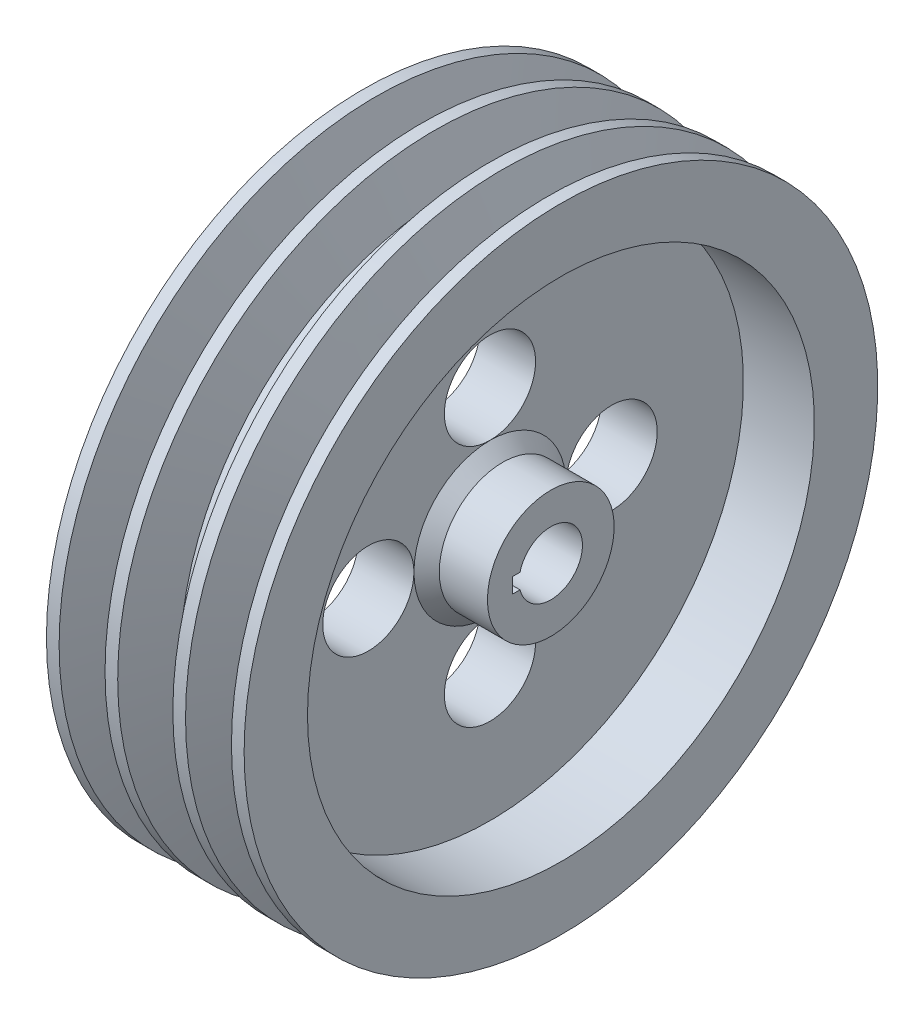
ISO-10303-21;
HEADER;
FILE_DESCRIPTION(('STEP AP214'),'2;1');
FILE_NAME('part.step','',(''),(''),'','','');
FILE_SCHEMA(('AUTOMOTIVE_DESIGN { 1 0 10303 214 1 1 1 1 }'));
ENDSEC;
DATA;
#1=APPLICATION_CONTEXT('core data for automotive mechanical design processes');
#2=APPLICATION_PROTOCOL_DEFINITION('international standard','automotive_design',2000,#1);
#3=PRODUCT_CONTEXT('',#1,'mechanical');
#4=PRODUCT('Part','Part','',(#3));
#5=PRODUCT_RELATED_PRODUCT_CATEGORY('part','',(#4));
#6=PRODUCT_DEFINITION_FORMATION('','',#4);
#7=PRODUCT_DEFINITION_CONTEXT('part definition',#1,'design');
#8=PRODUCT_DEFINITION('design','',#6,#7);
#9=PRODUCT_DEFINITION_SHAPE('','',#8);
#10=(LENGTH_UNIT() NAMED_UNIT(*) SI_UNIT(.MILLI.,.METRE.));
#11=(NAMED_UNIT(*) PLANE_ANGLE_UNIT() SI_UNIT($,.RADIAN.));
#12=(NAMED_UNIT(*) SI_UNIT($,.STERADIAN.) SOLID_ANGLE_UNIT());
#13=UNCERTAINTY_MEASURE_WITH_UNIT(LENGTH_MEASURE(1.E-05),#10,'distance_accuracy_value','');
#14=(GEOMETRIC_REPRESENTATION_CONTEXT(3) GLOBAL_UNCERTAINTY_ASSIGNED_CONTEXT((#13)) GLOBAL_UNIT_ASSIGNED_CONTEXT((#10,
#11,#12)) REPRESENTATION_CONTEXT('',''));
#15=CARTESIAN_POINT('',(0.,0.,0.));
#16=DIRECTION('',(0.,0.,1.));
#17=DIRECTION('',(1.,0.,0.));
#18=AXIS2_PLACEMENT_3D('',#15,#16,#17);
#19=CARTESIAN_POINT('',(39.,100.,0.));
#20=DIRECTION('',(-1.,0.,0.));
#21=DIRECTION('',(0.,0.,1.));
#22=AXIS2_PLACEMENT_3D('',#19,#20,#21);
#23=PLANE('',#22);
#24=CARTESIAN_POINT('',(39.,0.,0.));
#25=DIRECTION('',(-1.,0.,0.));
#26=DIRECTION('',(0.,0.,1.));
#27=AXIS2_PLACEMENT_3D('',#24,#25,#26);
#28=CIRCLE('',#27,125.);
#29=CARTESIAN_POINT('',(39.,0.,125.));
#30=VERTEX_POINT('',#29);
#31=EDGE_CURVE('E189',#30,#30,#28,.T.);
#32=ORIENTED_EDGE('',*,*,#31,.F.);
#33=EDGE_LOOP('',(#32));
#34=FACE_BOUND('',#33,.T.);
#35=CARTESIAN_POINT('',(39.,0.,0.));
#36=DIRECTION('',(-1.,0.,0.));
#37=DIRECTION('',(0.,0.,1.));
#38=AXIS2_PLACEMENT_3D('',#35,#36,#37);
#39=CIRCLE('',#38,100.);
#40=CARTESIAN_POINT('',(39.,0.,100.));
#41=VERTEX_POINT('',#40);
#42=EDGE_CURVE('E227',#41,#41,#39,.T.);
#43=ORIENTED_EDGE('',*,*,#42,.T.);
#44=EDGE_LOOP('',(#43));
#45=FACE_BOUND('',#44,.T.);
#46=ADVANCED_FACE('F38',(#34,#45),#23,.F.);
#47=CARTESIAN_POINT('',(-68.9140826306557,0.,0.));
#48=DIRECTION('',(-1.,0.,0.));
#49=DIRECTION('',(0.,0.,1.));
#50=AXIS2_PLACEMENT_3D('',#47,#48,#49);
#51=CYLINDRICAL_SURFACE('',#50,125.);
#52=CARTESIAN_POINT('',(34.,0.,0.));
#53=DIRECTION('',(-1.,0.,0.));
#54=DIRECTION('',(0.,0.,1.));
#55=AXIS2_PLACEMENT_3D('',#52,#53,#54);
#56=CIRCLE('',#55,125.);
#57=CARTESIAN_POINT('',(34.,0.,125.));
#58=VERTEX_POINT('',#57);
#59=EDGE_CURVE('E186',#58,#58,#56,.T.);
#60=ORIENTED_EDGE('',*,*,#59,.F.);
#61=EDGE_LOOP('',(#60));
#62=FACE_BOUND('',#61,.T.);
#63=ORIENTED_EDGE('',*,*,#31,.T.);
#64=EDGE_LOOP('',(#63));
#65=FACE_BOUND('',#64,.T.);
#66=ADVANCED_FACE('F256',(#62,#65),#51,.T.);
#67=CARTESIAN_POINT('',(34.,0.,0.));
#68=DIRECTION('',(1.,0.,0.));
#69=DIRECTION('',(0.,0.,-1.));
#70=AXIS2_PLACEMENT_3D('',#67,#68,#69);
#71=CONICAL_SURFACE('',#70,125.,1.25569459209027);
#72=CARTESIAN_POINT('',(28.1326842844011,0.,0.));
#73=DIRECTION('',(-1.,0.,0.));
#74=DIRECTION('',(0.,0.,1.));
#75=AXIS2_PLACEMENT_3D('',#72,#73,#74);
#76=CIRCLE('',#75,107.);
#77=CARTESIAN_POINT('',(28.1326842844011,0.,107.));
#78=VERTEX_POINT('',#77);
#79=EDGE_CURVE('E183',#78,#78,#76,.T.);
#80=ORIENTED_EDGE('',*,*,#79,.F.);
#81=EDGE_LOOP('',(#80));
#82=FACE_BOUND('',#81,.T.);
#83=ORIENTED_EDGE('',*,*,#59,.T.);
#84=EDGE_LOOP('',(#83));
#85=FACE_BOUND('',#84,.T.);
#86=ADVANCED_FACE('F261',(#82,#85),#71,.T.);
#87=CARTESIAN_POINT('',(-68.9140826306557,0.,0.));
#88=DIRECTION('',(-1.,0.,0.));
#89=DIRECTION('',(0.,0.,1.));
#90=AXIS2_PLACEMENT_3D('',#87,#88,#89);
#91=CYLINDRICAL_SURFACE('',#90,107.);
#92=CARTESIAN_POINT('',(23.1326842844012,0.,0.));
#93=DIRECTION('',(-1.,0.,0.));
#94=DIRECTION('',(0.,0.,1.));
#95=AXIS2_PLACEMENT_3D('',#92,#93,#94);
#96=CIRCLE('',#95,107.);
#97=CARTESIAN_POINT('',(23.1326842844012,0.,107.));
#98=VERTEX_POINT('',#97);
#99=EDGE_CURVE('E180',#98,#98,#96,.T.);
#100=ORIENTED_EDGE('',*,*,#99,.F.);
#101=EDGE_LOOP('',(#100));
#102=FACE_BOUND('',#101,.T.);
#103=ORIENTED_EDGE('',*,*,#79,.T.);
#104=EDGE_LOOP('',(#103));
#105=FACE_BOUND('',#104,.T.);
#106=ADVANCED_FACE('F583',(#102,#105),#91,.T.);
#107=CARTESIAN_POINT('',(23.1326842844012,0.,0.));
#108=DIRECTION('',(-1.,0.,0.));
#109=DIRECTION('',(0.,0.,1.));
#110=AXIS2_PLACEMENT_3D('',#107,#108,#109);
#111=CONICAL_SURFACE('',#110,107.,1.1877663607018);
#112=CARTESIAN_POINT('',(15.8799383909303,0.,0.));
#113=DIRECTION('',(-1.,0.,0.));
#114=DIRECTION('',(0.,0.,1.));
#115=AXIS2_PLACEMENT_3D('',#112,#113,#114);
#116=CIRCLE('',#115,125.);
#117=CARTESIAN_POINT('',(15.8799383909303,0.,125.));
#118=VERTEX_POINT('',#117);
#119=EDGE_CURVE('E177',#118,#118,#116,.T.);
#120=ORIENTED_EDGE('',*,*,#119,.F.);
#121=EDGE_LOOP('',(#120));
#122=FACE_BOUND('',#121,.T.);
#123=ORIENTED_EDGE('',*,*,#99,.T.);
#124=EDGE_LOOP('',(#123));
#125=FACE_BOUND('',#124,.T.);
#126=ADVANCED_FACE('F573',(#122,#125),#111,.T.);
#127=CARTESIAN_POINT('',(-68.9140826306557,0.,0.));
#128=DIRECTION('',(-1.,0.,0.));
#129=DIRECTION('',(0.,0.,1.));
#130=AXIS2_PLACEMENT_3D('',#127,#128,#129);
#131=CYLINDRICAL_SURFACE('',#130,125.);
#132=CARTESIAN_POINT('',(10.8799383909303,0.,0.));
#133=DIRECTION('',(-1.,0.,0.));
#134=DIRECTION('',(0.,0.,1.));
#135=AXIS2_PLACEMENT_3D('',#132,#133,#134);
#136=CIRCLE('',#135,125.);
#137=CARTESIAN_POINT('',(10.8799383909303,0.,125.));
#138=VERTEX_POINT('',#137);
#139=EDGE_CURVE('E174',#138,#138,#136,.T.);
#140=ORIENTED_EDGE('',*,*,#139,.F.);
#141=EDGE_LOOP('',(#140));
#142=FACE_BOUND('',#141,.T.);
#143=ORIENTED_EDGE('',*,*,#119,.T.);
#144=EDGE_LOOP('',(#143));
#145=FACE_BOUND('',#144,.T.);
#146=ADVANCED_FACE('F563',(#142,#145),#131,.T.);
#147=CARTESIAN_POINT('',(10.8799383909303,0.,0.));
#148=DIRECTION('',(1.,0.,0.));
#149=DIRECTION('',(0.,0.,-1.));
#150=AXIS2_PLACEMENT_3D('',#147,#148,#149);
#151=CONICAL_SURFACE('',#150,125.,1.22173047639604);
#152=CARTESIAN_POINT('',(4.32847417413881,0.,0.));
#153=DIRECTION('',(-1.,0.,0.));
#154=DIRECTION('',(0.,0.,1.));
#155=AXIS2_PLACEMENT_3D('',#152,#153,#154);
#156=CIRCLE('',#155,107.);
#157=CARTESIAN_POINT('',(4.32847417413881,0.,107.));
#158=VERTEX_POINT('',#157);
#159=EDGE_CURVE('E171',#158,#158,#156,.T.);
#160=ORIENTED_EDGE('',*,*,#159,.F.);
#161=EDGE_LOOP('',(#160));
#162=FACE_BOUND('',#161,.T.);
#163=ORIENTED_EDGE('',*,*,#139,.T.);
#164=EDGE_LOOP('',(#163));
#165=FACE_BOUND('',#164,.T.);
#166=ADVANCED_FACE('F553',(#162,#165),#151,.T.);
#167=CARTESIAN_POINT('',(-68.9140826306557,0.,0.));
#168=DIRECTION('',(-1.,0.,0.));
#169=DIRECTION('',(0.,0.,1.));
#170=AXIS2_PLACEMENT_3D('',#167,#168,#169);
#171=CYLINDRICAL_SURFACE('',#170,107.);
#172=CARTESIAN_POINT('',(-4.32847417413881,0.,0.));
#173=DIRECTION('',(-1.,0.,0.));
#174=DIRECTION('',(0.,0.,1.));
#175=AXIS2_PLACEMENT_3D('',#172,#173,#174);
#176=CIRCLE('',#175,107.);
#177=CARTESIAN_POINT('',(-4.32847417413881,0.,107.));
#178=VERTEX_POINT('',#177);
#179=EDGE_CURVE('E168',#178,#178,#176,.T.);
#180=ORIENTED_EDGE('',*,*,#179,.F.);
#181=EDGE_LOOP('',(#180));
#182=FACE_BOUND('',#181,.T.);
#183=ORIENTED_EDGE('',*,*,#159,.T.);
#184=EDGE_LOOP('',(#183));
#185=FACE_BOUND('',#184,.T.);
#186=ADVANCED_FACE('F543',(#182,#185),#171,.T.);
#187=CARTESIAN_POINT('',(-4.32847417413881,0.,0.));
#188=DIRECTION('',(-1.,0.,0.));
#189=DIRECTION('',(0.,0.,1.));
#190=AXIS2_PLACEMENT_3D('',#187,#188,#189);
#191=CONICAL_SURFACE('',#190,107.,1.22173047639604);
#192=CARTESIAN_POINT('',(-10.8799383909303,0.,0.));
#193=DIRECTION('',(-1.,0.,0.));
#194=DIRECTION('',(0.,0.,1.));
#195=AXIS2_PLACEMENT_3D('',#192,#193,#194);
#196=CIRCLE('',#195,125.);
#197=CARTESIAN_POINT('',(-10.8799383909303,0.,125.));
#198=VERTEX_POINT('',#197);
#199=EDGE_CURVE('E165',#198,#198,#196,.T.);
#200=ORIENTED_EDGE('',*,*,#199,.F.);
#201=EDGE_LOOP('',(#200));
#202=FACE_BOUND('',#201,.T.);
#203=ORIENTED_EDGE('',*,*,#179,.T.);
#204=EDGE_LOOP('',(#203));
#205=FACE_BOUND('',#204,.T.);
#206=ADVANCED_FACE('F533',(#202,#205),#191,.T.);
#207=CARTESIAN_POINT('',(-68.9140826306557,0.,0.));
#208=DIRECTION('',(-1.,0.,0.));
#209=DIRECTION('',(0.,0.,1.));
#210=AXIS2_PLACEMENT_3D('',#207,#208,#209);
#211=CYLINDRICAL_SURFACE('',#210,125.);
#212=CARTESIAN_POINT('',(-15.8799383909303,0.,0.));
#213=DIRECTION('',(-1.,0.,0.));
#214=DIRECTION('',(0.,0.,1.));
#215=AXIS2_PLACEMENT_3D('',#212,#213,#214);
#216=CIRCLE('',#215,125.);
#217=CARTESIAN_POINT('',(-15.8799383909303,0.,125.));
#218=VERTEX_POINT('',#217);
#219=EDGE_CURVE('E162',#218,#218,#216,.T.);
#220=ORIENTED_EDGE('',*,*,#219,.F.);
#221=EDGE_LOOP('',(#220));
#222=FACE_BOUND('',#221,.T.);
#223=ORIENTED_EDGE('',*,*,#199,.T.);
#224=EDGE_LOOP('',(#223));
#225=FACE_BOUND('',#224,.T.);
#226=ADVANCED_FACE('F523',(#222,#225),#211,.T.);
#227=CARTESIAN_POINT('',(-15.8799383909303,0.,0.));
#228=DIRECTION('',(1.,0.,0.));
#229=DIRECTION('',(0.,0.,-1.));
#230=AXIS2_PLACEMENT_3D('',#227,#228,#229);
#231=CONICAL_SURFACE('',#230,125.,1.1877663607018);
#232=CARTESIAN_POINT('',(-23.1326842844011,0.,0.));
#233=DIRECTION('',(-1.,0.,0.));
#234=DIRECTION('',(0.,0.,1.));
#235=AXIS2_PLACEMENT_3D('',#232,#233,#234);
#236=CIRCLE('',#235,107.);
#237=CARTESIAN_POINT('',(-23.1326842844011,0.,107.));
#238=VERTEX_POINT('',#237);
#239=EDGE_CURVE('E159',#238,#238,#236,.T.);
#240=ORIENTED_EDGE('',*,*,#239,.F.);
#241=EDGE_LOOP('',(#240));
#242=FACE_BOUND('',#241,.T.);
#243=ORIENTED_EDGE('',*,*,#219,.T.);
#244=EDGE_LOOP('',(#243));
#245=FACE_BOUND('',#244,.T.);
#246=ADVANCED_FACE('F513',(#242,#245),#231,.T.);
#247=CARTESIAN_POINT('',(-68.9140826306557,0.,0.));
#248=DIRECTION('',(-1.,0.,0.));
#249=DIRECTION('',(0.,0.,1.));
#250=AXIS2_PLACEMENT_3D('',#247,#248,#249);
#251=CYLINDRICAL_SURFACE('',#250,107.);
#252=CARTESIAN_POINT('',(-28.1326842844011,0.,0.));
#253=DIRECTION('',(-1.,0.,0.));
#254=DIRECTION('',(0.,0.,1.));
#255=AXIS2_PLACEMENT_3D('',#252,#253,#254);
#256=CIRCLE('',#255,107.);
#257=CARTESIAN_POINT('',(-28.1326842844011,0.,107.));
#258=VERTEX_POINT('',#257);
#259=EDGE_CURVE('E156',#258,#258,#256,.T.);
#260=ORIENTED_EDGE('',*,*,#259,.F.);
#261=EDGE_LOOP('',(#260));
#262=FACE_BOUND('',#261,.T.);
#263=ORIENTED_EDGE('',*,*,#239,.T.);
#264=EDGE_LOOP('',(#263));
#265=FACE_BOUND('',#264,.T.);
#266=ADVANCED_FACE('F503',(#262,#265),#251,.T.);
#267=CARTESIAN_POINT('',(-28.1326842844011,0.,0.));
#268=DIRECTION('',(-1.,0.,0.));
#269=DIRECTION('',(0.,0.,1.));
#270=AXIS2_PLACEMENT_3D('',#267,#268,#269);
#271=CONICAL_SURFACE('',#270,107.,1.25569459209027);
#272=CARTESIAN_POINT('',(-34.,0.,0.));
#273=DIRECTION('',(-1.,0.,0.));
#274=DIRECTION('',(0.,0.,1.));
#275=AXIS2_PLACEMENT_3D('',#272,#273,#274);
#276=CIRCLE('',#275,125.);
#277=CARTESIAN_POINT('',(-34.,0.,125.));
#278=VERTEX_POINT('',#277);
#279=EDGE_CURVE('E153',#278,#278,#276,.T.);
#280=ORIENTED_EDGE('',*,*,#279,.F.);
#281=EDGE_LOOP('',(#280));
#282=FACE_BOUND('',#281,.T.);
#283=ORIENTED_EDGE('',*,*,#259,.T.);
#284=EDGE_LOOP('',(#283));
#285=FACE_BOUND('',#284,.T.);
#286=ADVANCED_FACE('F493',(#282,#285),#271,.T.);
#287=CARTESIAN_POINT('',(-68.9140826306557,0.,0.));
#288=DIRECTION('',(-1.,0.,0.));
#289=DIRECTION('',(0.,0.,1.));
#290=AXIS2_PLACEMENT_3D('',#287,#288,#289);
#291=CYLINDRICAL_SURFACE('',#290,125.);
#292=CARTESIAN_POINT('',(-39.,0.,0.));
#293=DIRECTION('',(-1.,0.,0.));
#294=DIRECTION('',(0.,0.,1.));
#295=AXIS2_PLACEMENT_3D('',#292,#293,#294);
#296=CIRCLE('',#295,125.);
#297=CARTESIAN_POINT('',(-39.,0.,125.));
#298=VERTEX_POINT('',#297);
#299=EDGE_CURVE('E150',#298,#298,#296,.T.);
#300=ORIENTED_EDGE('',*,*,#299,.F.);
#301=EDGE_LOOP('',(#300));
#302=FACE_BOUND('',#301,.T.);
#303=ORIENTED_EDGE('',*,*,#279,.T.);
#304=EDGE_LOOP('',(#303));
#305=FACE_BOUND('',#304,.T.);
#306=ADVANCED_FACE('F483',(#302,#305),#291,.T.);
#307=CARTESIAN_POINT('',(-39.,100.,0.));
#308=DIRECTION('',(1.,0.,0.));
#309=DIRECTION('',(0.,0.,-1.));
#310=AXIS2_PLACEMENT_3D('',#307,#308,#309);
#311=PLANE('',#310);
#312=CARTESIAN_POINT('',(-39.,0.,0.));
#313=DIRECTION('',(-1.,0.,0.));
#314=DIRECTION('',(0.,0.,1.));
#315=AXIS2_PLACEMENT_3D('',#312,#313,#314);
#316=CIRCLE('',#315,100.);
#317=CARTESIAN_POINT('',(-39.,0.,100.));
#318=VERTEX_POINT('',#317);
#319=EDGE_CURVE('E147',#318,#318,#316,.T.);
#320=ORIENTED_EDGE('',*,*,#319,.F.);
#321=EDGE_LOOP('',(#320));
#322=FACE_BOUND('',#321,.T.);
#323=ORIENTED_EDGE('',*,*,#299,.T.);
#324=EDGE_LOOP('',(#323));
#325=FACE_BOUND('',#324,.T.);
#326=ADVANCED_FACE('F473',(#322,#325),#311,.F.);
#327=CARTESIAN_POINT('',(-68.9140826306557,0.,0.));
#328=DIRECTION('',(-1.,0.,0.));
#329=DIRECTION('',(0.,0.,1.));
#330=AXIS2_PLACEMENT_3D('',#327,#328,#329);
#331=CYLINDRICAL_SURFACE('',#330,100.);
#332=CARTESIAN_POINT('',(-11.,0.,0.));
#333=DIRECTION('',(-1.,0.,0.));
#334=DIRECTION('',(0.,0.,1.));
#335=AXIS2_PLACEMENT_3D('',#332,#333,#334);
#336=CIRCLE('',#335,100.);
#337=CARTESIAN_POINT('',(-11.,0.,100.));
#338=VERTEX_POINT('',#337);
#339=EDGE_CURVE('E143',#338,#338,#336,.T.);
#340=ORIENTED_EDGE('',*,*,#339,.F.);
#341=EDGE_LOOP('',(#340));
#342=FACE_BOUND('',#341,.T.);
#343=ORIENTED_EDGE('',*,*,#319,.T.);
#344=EDGE_LOOP('',(#343));
#345=FACE_BOUND('',#344,.T.);
#346=ADVANCED_FACE('F463',(#342,#345),#331,.F.);
#347=CARTESIAN_POINT('',(-11.,39.2865376641565,0.));
#348=DIRECTION('',(1.,0.,0.));
#349=DIRECTION('',(0.,0.,-1.));
#350=AXIS2_PLACEMENT_3D('',#347,#348,#349);
#351=PLANE('',#350);
#352=CARTESIAN_POINT('',(-11.,0.,0.));
#353=DIRECTION('',(-1.,0.,0.));
#354=DIRECTION('',(0.,0.,1.));
#355=AXIS2_PLACEMENT_3D('',#352,#353,#354);
#356=CIRCLE('',#355,30.);
#357=CARTESIAN_POINT('',(-11.,30.,0.));
#358=VERTEX_POINT('',#357);
#359=CARTESIAN_POINT('',(-11.,3.20851044143431E-13,-30.));
#360=VERTEX_POINT('',#359);
#361=EDGE_CURVE('E144',#358,#360,#356,.T.);
#362=ORIENTED_EDGE('',*,*,#361,.F.);
#363=CARTESIAN_POINT('',(-11.,48.,0.));
#364=DIRECTION('',(1.,0.,0.));
#365=DIRECTION('',(0.,0.,-1.));
#366=AXIS2_PLACEMENT_3D('',#363,#364,#365);
#367=CIRCLE('',#366,18.);
#368=EDGE_CURVE('E206',#358,#358,#367,.T.);
#369=ORIENTED_EDGE('',*,*,#368,.T.);
#370=CARTESIAN_POINT('',(-11.,-1.11362163812843E-13,30.));
#371=VERTEX_POINT('',#370);
#372=EDGE_CURVE('E140',#371,#358,#356,.T.);
#373=ORIENTED_EDGE('',*,*,#372,.F.);
#374=CARTESIAN_POINT('',(-11.,-1.78179462100549E-13,48.));
#375=DIRECTION('',(1.,0.,0.));
#376=DIRECTION('',(0.,0.,-1.));
#377=AXIS2_PLACEMENT_3D('',#374,#375,#376);
#378=CIRCLE('',#377,18.);
#379=EDGE_CURVE('E202',#371,#371,#378,.T.);
#380=ORIENTED_EDGE('',*,*,#379,.T.);
#381=CARTESIAN_POINT('',(-11.,-30.,-2.16106603978137E-13));
#382=VERTEX_POINT('',#381);
#383=EDGE_CURVE('E139',#382,#371,#356,.T.);
#384=ORIENTED_EDGE('',*,*,#383,.F.);
#385=CARTESIAN_POINT('',(-11.,-48.,-3.4577056636502E-13));
#386=DIRECTION('',(1.,0.,0.));
#387=DIRECTION('',(0.,0.,-1.));
#388=AXIS2_PLACEMENT_3D('',#385,#386,#387);
#389=CIRCLE('',#388,18.);
#390=EDGE_CURVE('E58',#382,#382,#389,.T.);
#391=ORIENTED_EDGE('',*,*,#390,.T.);
#392=EDGE_CURVE('E698',#360,#382,#356,.T.);
#393=ORIENTED_EDGE('',*,*,#392,.F.);
#394=CARTESIAN_POINT('',(-11.,5.1336167062949E-13,-48.));
#395=DIRECTION('',(1.,0.,0.));
#396=DIRECTION('',(0.,0.,-1.));
#397=AXIS2_PLACEMENT_3D('',#394,#395,#396);
#398=CIRCLE('',#397,18.);
#399=EDGE_CURVE('E195',#360,#360,#398,.T.);
#400=ORIENTED_EDGE('',*,*,#399,.T.);
#401=EDGE_LOOP('',(#362,#369,#373,#380,#384,#391,#393,#400));
#402=FACE_BOUND('',#401,.T.);
#403=ORIENTED_EDGE('',*,*,#339,.T.);
#404=EDGE_LOOP('',(#403));
#405=FACE_BOUND('',#404,.T.);
#406=ADVANCED_FACE('F453',(#402,#405),#351,.F.);
#407=CARTESIAN_POINT('',(-11.,0.,0.));
#408=DIRECTION('',(1.,0.,0.));
#409=DIRECTION('',(0.,0.,-1.));
#410=AXIS2_PLACEMENT_3D('',#407,#408,#409);
#411=CONICAL_SURFACE('',#410,30.,0.785398163397448);
#412=CARTESIAN_POINT('',(-16.,0.,0.));
#413=DIRECTION('',(-1.,0.,0.));
#414=DIRECTION('',(0.,0.,1.));
#415=AXIS2_PLACEMENT_3D('',#412,#413,#414);
#416=CIRCLE('',#415,25.);
#417=CARTESIAN_POINT('',(-16.,0.,25.));
#418=VERTEX_POINT('',#417);
#419=EDGE_CURVE('E136',#418,#418,#416,.T.);
#420=ORIENTED_EDGE('',*,*,#419,.F.);
#421=EDGE_LOOP('',(#420));
#422=FACE_BOUND('',#421,.T.);
#423=ORIENTED_EDGE('',*,*,#372,.T.);
#424=ORIENTED_EDGE('',*,*,#361,.T.);
#425=ORIENTED_EDGE('',*,*,#392,.T.);
#426=ORIENTED_EDGE('',*,*,#383,.T.);
#427=EDGE_LOOP('',(#423,#424,#425,#426));
#428=FACE_BOUND('',#427,.T.);
#429=ADVANCED_FACE('F443',(#422,#428),#411,.T.);
#430=CARTESIAN_POINT('',(-68.9140826306557,0.,0.));
#431=DIRECTION('',(-1.,0.,0.));
#432=DIRECTION('',(0.,0.,1.));
#433=AXIS2_PLACEMENT_3D('',#430,#431,#432);
#434=CYLINDRICAL_SURFACE('',#433,25.);
#435=CARTESIAN_POINT('',(-30.,0.,0.));
#436=DIRECTION('',(-1.,0.,0.));
#437=DIRECTION('',(0.,0.,1.));
#438=AXIS2_PLACEMENT_3D('',#435,#436,#437);
#439=CIRCLE('',#438,25.);
#440=CARTESIAN_POINT('',(-30.,0.,25.));
#441=VERTEX_POINT('',#440);
#442=EDGE_CURVE('E128',#441,#441,#439,.T.);
#443=ORIENTED_EDGE('',*,*,#442,.F.);
#444=EDGE_LOOP('',(#443));
#445=FACE_BOUND('',#444,.T.);
#446=ORIENTED_EDGE('',*,*,#419,.T.);
#447=EDGE_LOOP('',(#446));
#448=FACE_BOUND('',#447,.T.);
#449=ADVANCED_FACE('F433',(#445,#448),#434,.T.);
#450=CARTESIAN_POINT('',(-30.,0.,0.));
#451=DIRECTION('',(-1.,0.,0.));
#452=DIRECTION('',(0.,0.,1.));
#453=AXIS2_PLACEMENT_3D('',#450,#451,#452);
#454=TOROIDAL_SURFACE('',#453,20.,5.);
#455=CARTESIAN_POINT('',(-35.,0.,0.));
#456=DIRECTION('',(-1.,0.,0.));
#457=DIRECTION('',(0.,0.,1.));
#458=AXIS2_PLACEMENT_3D('',#455,#456,#457);
#459=CIRCLE('',#458,20.);
#460=CARTESIAN_POINT('',(-35.,0.,20.));
#461=VERTEX_POINT('',#460);
#462=EDGE_CURVE('E124',#461,#461,#459,.T.);
#463=ORIENTED_EDGE('',*,*,#462,.F.);
#464=EDGE_LOOP('',(#463));
#465=FACE_BOUND('',#464,.T.);
#466=ORIENTED_EDGE('',*,*,#442,.T.);
#467=EDGE_LOOP('',(#466));
#468=FACE_BOUND('',#467,.T.);
#469=ADVANCED_FACE('F357',(#465,#468),#454,.T.);
#470=CARTESIAN_POINT('',(-35.,20.,0.));
#471=DIRECTION('',(1.,0.,0.));
#472=DIRECTION('',(0.,0.,-1.));
#473=AXIS2_PLACEMENT_3D('',#470,#471,#472);
#474=PLANE('',#473);
#475=CARTESIAN_POINT('',(-35.,0.,0.));
#476=DIRECTION('',(-1.,0.,0.));
#477=DIRECTION('',(0.,0.,1.));
#478=AXIS2_PLACEMENT_3D('',#475,#476,#477);
#479=CIRCLE('',#478,12.5);
#480=CARTESIAN_POINT('',(-35.,3.,12.1346610995116));
#481=VERTEX_POINT('',#480);
#482=CARTESIAN_POINT('',(-35.,-3.,12.1346610995116));
#483=VERTEX_POINT('',#482);
#484=EDGE_CURVE('E117',#481,#483,#479,.T.);
#485=ORIENTED_EDGE('',*,*,#484,.F.);
#486=DIRECTION('',(0.,0.,-1.));
#487=VECTOR('',#486,1.);
#488=CARTESIAN_POINT('',(-35.,3.,12.1346610995116));
#489=LINE('',#488,#487);
#490=CARTESIAN_POINT('',(-35.,3.,15.1346610995116));
#491=VERTEX_POINT('',#490);
#492=EDGE_CURVE('E110',#491,#481,#489,.T.);
#493=ORIENTED_EDGE('',*,*,#492,.F.);
#494=DIRECTION('',(0.,1.,0.));
#495=VECTOR('',#494,1.);
#496=CARTESIAN_POINT('',(-35.,3.,15.1346610995116));
#497=LINE('',#496,#495);
#498=CARTESIAN_POINT('',(-35.,-3.,15.1346610995116));
#499=VERTEX_POINT('',#498);
#500=EDGE_CURVE('E119',#499,#491,#497,.T.);
#501=ORIENTED_EDGE('',*,*,#500,.F.);
#502=DIRECTION('',(0.,0.,1.));
#503=VECTOR('',#502,1.);
#504=CARTESIAN_POINT('',(-35.,-3.,15.1346610995116));
#505=LINE('',#504,#503);
#506=EDGE_CURVE('E102',#483,#499,#505,.T.);
#507=ORIENTED_EDGE('',*,*,#506,.F.);
#508=EDGE_LOOP('',(#485,#493,#501,#507));
#509=FACE_BOUND('',#508,.T.);
#510=ORIENTED_EDGE('',*,*,#462,.T.);
#511=EDGE_LOOP('',(#510));
#512=FACE_BOUND('',#511,.T.);
#513=ADVANCED_FACE('F114',(#509,#512),#474,.F.);
#514=CARTESIAN_POINT('',(-68.9140826306557,0.,0.));
#515=DIRECTION('',(-1.,0.,0.));
#516=DIRECTION('',(0.,0.,1.));
#517=AXIS2_PLACEMENT_3D('',#514,#515,#516);
#518=CYLINDRICAL_SURFACE('',#517,12.5);
#519=CARTESIAN_POINT('',(35.,0.,0.));
#520=DIRECTION('',(-1.,0.,0.));
#521=DIRECTION('',(0.,0.,1.));
#522=AXIS2_PLACEMENT_3D('',#519,#520,#521);
#523=CIRCLE('',#522,12.5);
#524=CARTESIAN_POINT('',(35.,3.,12.1346610995116));
#525=VERTEX_POINT('',#524);
#526=CARTESIAN_POINT('',(35.,-3.,12.1346610995116));
#527=VERTEX_POINT('',#526);
#528=EDGE_CURVE('E125',#525,#527,#523,.T.);
#529=ORIENTED_EDGE('',*,*,#528,.F.);
#530=DIRECTION('',(-1.,0.,0.));
#531=VECTOR('',#530,1.);
#532=CARTESIAN_POINT('',(39.,3.,12.1346610995116));
#533=LINE('',#532,#531);
#534=EDGE_CURVE('E123',#525,#481,#533,.T.);
#535=ORIENTED_EDGE('',*,*,#534,.T.);
#536=ORIENTED_EDGE('',*,*,#484,.T.);
#537=DIRECTION('',(-1.,0.,0.));
#538=VECTOR('',#537,1.);
#539=CARTESIAN_POINT('',(39.,-3.,12.1346610995116));
#540=LINE('',#539,#538);
#541=EDGE_CURVE('E99',#527,#483,#540,.T.);
#542=ORIENTED_EDGE('',*,*,#541,.F.);
#543=EDGE_LOOP('',(#529,#535,#536,#542));
#544=FACE_BOUND('',#543,.T.);
#545=ADVANCED_FACE('F122',(#544),#518,.F.);
#546=CARTESIAN_POINT('',(35.,12.5,0.));
#547=DIRECTION('',(-1.,0.,0.));
#548=DIRECTION('',(0.,0.,1.));
#549=AXIS2_PLACEMENT_3D('',#546,#547,#548);
#550=PLANE('',#549);
#551=CARTESIAN_POINT('',(35.,0.,0.));
#552=DIRECTION('',(-1.,0.,0.));
#553=DIRECTION('',(0.,0.,1.));
#554=AXIS2_PLACEMENT_3D('',#551,#552,#553);
#555=CIRCLE('',#554,25.);
#556=CARTESIAN_POINT('',(35.,0.,25.));
#557=VERTEX_POINT('',#556);
#558=EDGE_CURVE('E130',#557,#557,#555,.T.);
#559=ORIENTED_EDGE('',*,*,#558,.F.);
#560=EDGE_LOOP('',(#559));
#561=FACE_BOUND('',#560,.T.);
#562=DIRECTION('',(0.,1.,0.));
#563=VECTOR('',#562,1.);
#564=CARTESIAN_POINT('',(35.,12.5,15.1346610995116));
#565=LINE('',#564,#563);
#566=CARTESIAN_POINT('',(35.,-3.,15.1346610995116));
#567=VERTEX_POINT('',#566);
#568=CARTESIAN_POINT('',(35.,3.,15.1346610995116));
#569=VERTEX_POINT('',#568);
#570=EDGE_CURVE('E45',#567,#569,#565,.T.);
#571=ORIENTED_EDGE('',*,*,#570,.T.);
#572=DIRECTION('',(0.,0.,-1.));
#573=VECTOR('',#572,1.);
#574=CARTESIAN_POINT('',(35.,3.,0.));
#575=LINE('',#574,#573);
#576=EDGE_CURVE('E12',#569,#525,#575,.T.);
#577=ORIENTED_EDGE('',*,*,#576,.T.);
#578=ORIENTED_EDGE('',*,*,#528,.T.);
#579=DIRECTION('',(0.,0.,1.));
#580=VECTOR('',#579,1.);
#581=CARTESIAN_POINT('',(35.,-3.,0.));
#582=LINE('',#581,#580);
#583=EDGE_CURVE('E105',#527,#567,#582,.T.);
#584=ORIENTED_EDGE('',*,*,#583,.T.);
#585=EDGE_LOOP('',(#571,#577,#578,#584));
#586=FACE_BOUND('',#585,.T.);
#587=ADVANCED_FACE('F209',(#561,#586),#550,.F.);
#588=CARTESIAN_POINT('',(-68.9140826306557,0.,0.));
#589=DIRECTION('',(-1.,0.,0.));
#590=DIRECTION('',(0.,0.,1.));
#591=AXIS2_PLACEMENT_3D('',#588,#589,#590);
#592=CYLINDRICAL_SURFACE('',#591,25.);
#593=CARTESIAN_POINT('',(16.,0.,0.));
#594=DIRECTION('',(-1.,0.,0.));
#595=DIRECTION('',(0.,0.,1.));
#596=AXIS2_PLACEMENT_3D('',#593,#594,#595);
#597=CIRCLE('',#596,25.);
#598=CARTESIAN_POINT('',(16.,0.,25.));
#599=VERTEX_POINT('',#598);
#600=EDGE_CURVE('E237',#599,#599,#597,.T.);
#601=ORIENTED_EDGE('',*,*,#600,.F.);
#602=EDGE_LOOP('',(#601));
#603=FACE_BOUND('',#602,.T.);
#604=ORIENTED_EDGE('',*,*,#558,.T.);
#605=EDGE_LOOP('',(#604));
#606=FACE_BOUND('',#605,.T.);
#607=ADVANCED_FACE('F243',(#603,#606),#592,.T.);
#608=CARTESIAN_POINT('',(16.,0.,0.));
#609=DIRECTION('',(-1.,0.,0.));
#610=DIRECTION('',(0.,0.,1.));
#611=AXIS2_PLACEMENT_3D('',#608,#609,#610);
#612=CONICAL_SURFACE('',#611,25.,0.785398163397448);
#613=CARTESIAN_POINT('',(11.,0.,0.));
#614=DIRECTION('',(-1.,0.,0.));
#615=DIRECTION('',(0.,0.,1.));
#616=AXIS2_PLACEMENT_3D('',#613,#614,#615);
#617=CIRCLE('',#616,30.);
#618=CARTESIAN_POINT('',(11.,-1.11362163812843E-13,30.));
#619=VERTEX_POINT('',#618);
#620=CARTESIAN_POINT('',(11.,30.,0.));
#621=VERTEX_POINT('',#620);
#622=EDGE_CURVE('E234',#619,#621,#617,.T.);
#623=ORIENTED_EDGE('',*,*,#622,.F.);
#624=CARTESIAN_POINT('',(11.,-30.,-2.16106603978137E-13));
#625=VERTEX_POINT('',#624);
#626=EDGE_CURVE('E233',#625,#619,#617,.T.);
#627=ORIENTED_EDGE('',*,*,#626,.F.);
#628=CARTESIAN_POINT('',(11.,3.20851044143431E-13,-30.));
#629=VERTEX_POINT('',#628);
#630=EDGE_CURVE('E287',#629,#625,#617,.T.);
#631=ORIENTED_EDGE('',*,*,#630,.F.);
#632=EDGE_CURVE('E238',#621,#629,#617,.T.);
#633=ORIENTED_EDGE('',*,*,#632,.F.);
#634=EDGE_LOOP('',(#623,#627,#631,#633));
#635=FACE_BOUND('',#634,.T.);
#636=ORIENTED_EDGE('',*,*,#600,.T.);
#637=EDGE_LOOP('',(#636));
#638=FACE_BOUND('',#637,.T.);
#639=ADVANCED_FACE('F251',(#635,#638),#612,.T.);
#640=CARTESIAN_POINT('',(11.,75.2865376641565,0.));
#641=DIRECTION('',(-1.,0.,0.));
#642=DIRECTION('',(0.,0.,1.));
#643=AXIS2_PLACEMENT_3D('',#640,#641,#642);
#644=PLANE('',#643);
#645=CARTESIAN_POINT('',(11.,0.,0.));
#646=DIRECTION('',(-1.,0.,0.));
#647=DIRECTION('',(0.,0.,1.));
#648=AXIS2_PLACEMENT_3D('',#645,#646,#647);
#649=CIRCLE('',#648,100.);
#650=CARTESIAN_POINT('',(11.,0.,100.));
#651=VERTEX_POINT('',#650);
#652=EDGE_CURVE('E230',#651,#651,#649,.T.);
#653=ORIENTED_EDGE('',*,*,#652,.F.);
#654=EDGE_LOOP('',(#653));
#655=FACE_BOUND('',#654,.T.);
#656=ORIENTED_EDGE('',*,*,#622,.T.);
#657=CARTESIAN_POINT('',(11.,48.,0.));
#658=DIRECTION('',(-1.,0.,0.));
#659=DIRECTION('',(0.,0.,1.));
#660=AXIS2_PLACEMENT_3D('',#657,#658,#659);
#661=CIRCLE('',#660,18.);
#662=EDGE_CURVE('E203',#621,#621,#661,.T.);
#663=ORIENTED_EDGE('',*,*,#662,.T.);
#664=ORIENTED_EDGE('',*,*,#632,.T.);
#665=CARTESIAN_POINT('',(11.,5.1336167062949E-13,-48.));
#666=DIRECTION('',(-1.,0.,0.));
#667=DIRECTION('',(0.,0.,1.));
#668=AXIS2_PLACEMENT_3D('',#665,#666,#667);
#669=CIRCLE('',#668,18.);
#670=EDGE_CURVE('E192',#629,#629,#669,.T.);
#671=ORIENTED_EDGE('',*,*,#670,.T.);
#672=ORIENTED_EDGE('',*,*,#630,.T.);
#673=CARTESIAN_POINT('',(11.,-48.,-3.4577056636502E-13));
#674=DIRECTION('',(-1.,0.,0.));
#675=DIRECTION('',(0.,0.,1.));
#676=AXIS2_PLACEMENT_3D('',#673,#674,#675);
#677=CIRCLE('',#676,18.);
#678=EDGE_CURVE('E196',#625,#625,#677,.T.);
#679=ORIENTED_EDGE('',*,*,#678,.T.);
#680=ORIENTED_EDGE('',*,*,#626,.T.);
#681=CARTESIAN_POINT('',(11.,-1.78179462100549E-13,48.));
#682=DIRECTION('',(-1.,0.,0.));
#683=DIRECTION('',(0.,0.,1.));
#684=AXIS2_PLACEMENT_3D('',#681,#682,#683);
#685=CIRCLE('',#684,18.);
#686=EDGE_CURVE('E199',#619,#619,#685,.T.);
#687=ORIENTED_EDGE('',*,*,#686,.T.);
#688=EDGE_LOOP('',(#656,#663,#664,#671,#672,#679,#680,#687));
#689=FACE_BOUND('',#688,.T.);
#690=ADVANCED_FACE('F271',(#655,#689),#644,.F.);
#691=CARTESIAN_POINT('',(-68.9140826306557,0.,0.));
#692=DIRECTION('',(-1.,0.,0.));
#693=DIRECTION('',(0.,0.,1.));
#694=AXIS2_PLACEMENT_3D('',#691,#692,#693);
#695=CYLINDRICAL_SURFACE('',#694,100.);
#696=ORIENTED_EDGE('',*,*,#42,.F.);
#697=EDGE_LOOP('',(#696));
#698=FACE_BOUND('',#697,.T.);
#699=ORIENTED_EDGE('',*,*,#652,.T.);
#700=EDGE_LOOP('',(#699));
#701=FACE_BOUND('',#700,.T.);
#702=ADVANCED_FACE('F267',(#698,#701),#695,.F.);
#703=CARTESIAN_POINT('',(39.,5.1336167062949E-13,-48.));
#704=DIRECTION('',(-1.,0.,0.));
#705=DIRECTION('',(0.,0.,1.));
#706=AXIS2_PLACEMENT_3D('',#703,#704,#705);
#707=CYLINDRICAL_SURFACE('',#706,18.);
#708=ORIENTED_EDGE('',*,*,#670,.F.);
#709=EDGE_LOOP('',(#708));
#710=FACE_BOUND('',#709,.T.);
#711=ORIENTED_EDGE('',*,*,#399,.F.);
#712=EDGE_LOOP('',(#711));
#713=FACE_BOUND('',#712,.T.);
#714=ADVANCED_FACE('F270',(#710,#713),#707,.F.);
#715=CARTESIAN_POINT('',(39.,-48.,-3.4577056636502E-13));
#716=DIRECTION('',(-1.,0.,0.));
#717=DIRECTION('',(0.,0.,1.));
#718=AXIS2_PLACEMENT_3D('',#715,#716,#717);
#719=CYLINDRICAL_SURFACE('',#718,18.);
#720=ORIENTED_EDGE('',*,*,#678,.F.);
#721=EDGE_LOOP('',(#720));
#722=FACE_BOUND('',#721,.T.);
#723=ORIENTED_EDGE('',*,*,#390,.F.);
#724=EDGE_LOOP('',(#723));
#725=FACE_BOUND('',#724,.T.);
#726=ADVANCED_FACE('F289',(#722,#725),#719,.F.);
#727=CARTESIAN_POINT('',(39.,-1.78179462100549E-13,48.));
#728=DIRECTION('',(-1.,0.,0.));
#729=DIRECTION('',(0.,0.,1.));
#730=AXIS2_PLACEMENT_3D('',#727,#728,#729);
#731=CYLINDRICAL_SURFACE('',#730,18.);
#732=ORIENTED_EDGE('',*,*,#686,.F.);
#733=EDGE_LOOP('',(#732));
#734=FACE_BOUND('',#733,.T.);
#735=ORIENTED_EDGE('',*,*,#379,.F.);
#736=EDGE_LOOP('',(#735));
#737=FACE_BOUND('',#736,.T.);
#738=ADVANCED_FACE('F291',(#734,#737),#731,.F.);
#739=CARTESIAN_POINT('',(39.,48.,0.));
#740=DIRECTION('',(-1.,0.,0.));
#741=DIRECTION('',(0.,0.,1.));
#742=AXIS2_PLACEMENT_3D('',#739,#740,#741);
#743=CYLINDRICAL_SURFACE('',#742,18.);
#744=ORIENTED_EDGE('',*,*,#662,.F.);
#745=EDGE_LOOP('',(#744));
#746=FACE_BOUND('',#745,.T.);
#747=ORIENTED_EDGE('',*,*,#368,.F.);
#748=EDGE_LOOP('',(#747));
#749=FACE_BOUND('',#748,.T.);
#750=ADVANCED_FACE('F297',(#746,#749),#743,.F.);
#751=CARTESIAN_POINT('',(39.,3.,12.1346610995116));
#752=DIRECTION('',(0.,1.,0.));
#753=DIRECTION('',(0.,0.,1.));
#754=AXIS2_PLACEMENT_3D('',#751,#752,#753);
#755=PLANE('',#754);
#756=DIRECTION('',(-1.,0.,0.));
#757=VECTOR('',#756,1.);
#758=CARTESIAN_POINT('',(39.,3.,15.1346610995116));
#759=LINE('',#758,#757);
#760=EDGE_CURVE('E213',#569,#491,#759,.T.);
#761=ORIENTED_EDGE('',*,*,#760,.T.);
#762=ORIENTED_EDGE('',*,*,#492,.T.);
#763=ORIENTED_EDGE('',*,*,#534,.F.);
#764=ORIENTED_EDGE('',*,*,#576,.F.);
#765=EDGE_LOOP('',(#761,#762,#763,#764));
#766=FACE_BOUND('',#765,.T.);
#767=ADVANCED_FACE('F345',(#766),#755,.F.);
#768=CARTESIAN_POINT('',(39.,3.,15.1346610995116));
#769=DIRECTION('',(0.,0.,1.));
#770=DIRECTION('',(1.,0.,0.));
#771=AXIS2_PLACEMENT_3D('',#768,#769,#770);
#772=PLANE('',#771);
#773=DIRECTION('',(-1.,0.,0.));
#774=VECTOR('',#773,1.);
#775=CARTESIAN_POINT('',(39.,-3.,15.1346610995116));
#776=LINE('',#775,#774);
#777=EDGE_CURVE('E52',#567,#499,#776,.T.);
#778=ORIENTED_EDGE('',*,*,#777,.T.);
#779=ORIENTED_EDGE('',*,*,#500,.T.);
#780=ORIENTED_EDGE('',*,*,#760,.F.);
#781=ORIENTED_EDGE('',*,*,#570,.F.);
#782=EDGE_LOOP('',(#778,#779,#780,#781));
#783=FACE_BOUND('',#782,.T.);
#784=ADVANCED_FACE('F212',(#783),#772,.F.);
#785=CARTESIAN_POINT('',(39.,-3.,15.1346610995116));
#786=DIRECTION('',(0.,-1.,0.));
#787=DIRECTION('',(0.,0.,-1.));
#788=AXIS2_PLACEMENT_3D('',#785,#786,#787);
#789=PLANE('',#788);
#790=ORIENTED_EDGE('',*,*,#541,.T.);
#791=ORIENTED_EDGE('',*,*,#506,.T.);
#792=ORIENTED_EDGE('',*,*,#777,.F.);
#793=ORIENTED_EDGE('',*,*,#583,.F.);
#794=EDGE_LOOP('',(#790,#791,#792,#793));
#795=FACE_BOUND('',#794,.T.);
#796=ADVANCED_FACE('F101',(#795),#789,.F.);
#797=CLOSED_SHELL('',(#46,#66,#86,#106,#126,#146,#166,#186,#206,#226,#246,#266,#286,#306,#326,
#346,#406,#429,#449,#469,#513,#545,#587,#607,#639,#690,#702,#714,#726,#738,#750,#767,#784,#796));
#798=MANIFOLD_SOLID_BREP('B2',#797);
#799=ADVANCED_BREP_SHAPE_REPRESENTATION('',(#18,#798),#14);
#800=SHAPE_DEFINITION_REPRESENTATION(#9,#799);
ENDSEC;
END-ISO-10303-21;
